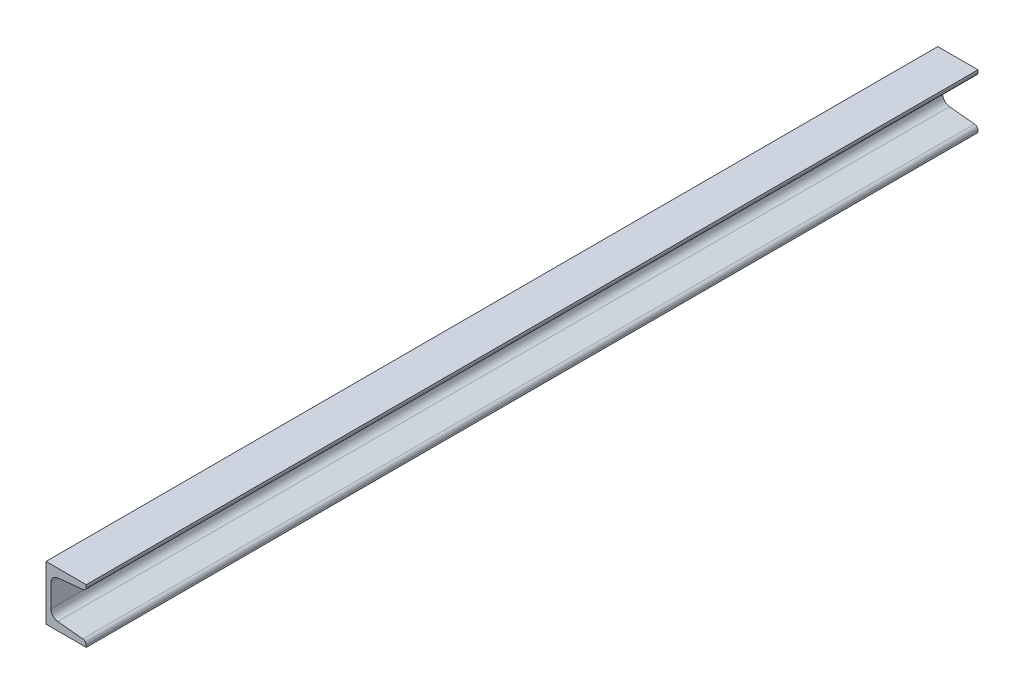
ISO-10303-21;
HEADER;
FILE_DESCRIPTION(('STEP AP214'),'2;1');
FILE_NAME('part.step','',(''),(''),'','','');
FILE_SCHEMA(('AUTOMOTIVE_DESIGN { 1 0 10303 214 1 1 1 1 }'));
ENDSEC;
DATA;
#1=APPLICATION_CONTEXT('core data for automotive mechanical design processes');
#2=APPLICATION_PROTOCOL_DEFINITION('international standard','automotive_design',2000,#1);
#3=PRODUCT_CONTEXT('',#1,'mechanical');
#4=PRODUCT('Part','Part','',(#3));
#5=PRODUCT_RELATED_PRODUCT_CATEGORY('part','',(#4));
#6=PRODUCT_DEFINITION_FORMATION('','',#4);
#7=PRODUCT_DEFINITION_CONTEXT('part definition',#1,'design');
#8=PRODUCT_DEFINITION('design','',#6,#7);
#9=PRODUCT_DEFINITION_SHAPE('','',#8);
#10=(LENGTH_UNIT() NAMED_UNIT(*) SI_UNIT(.MILLI.,.METRE.));
#11=(NAMED_UNIT(*) PLANE_ANGLE_UNIT() SI_UNIT($,.RADIAN.));
#12=(NAMED_UNIT(*) SI_UNIT($,.STERADIAN.) SOLID_ANGLE_UNIT());
#13=UNCERTAINTY_MEASURE_WITH_UNIT(LENGTH_MEASURE(1.E-05),#10,'distance_accuracy_value','');
#14=(GEOMETRIC_REPRESENTATION_CONTEXT(3) GLOBAL_UNCERTAINTY_ASSIGNED_CONTEXT((#13)) GLOBAL_UNIT_ASSIGNED_CONTEXT((#10,
#11,#12)) REPRESENTATION_CONTEXT('',''));
#15=CARTESIAN_POINT('',(0.,0.,0.));
#16=DIRECTION('',(0.,0.,1.));
#17=DIRECTION('',(1.,0.,0.));
#18=AXIS2_PLACEMENT_3D('',#15,#16,#17);
#19=CARTESIAN_POINT('',(0.,0.,820.));
#20=DIRECTION('',(0.,1.,0.));
#21=DIRECTION('',(0.,0.,1.));
#22=AXIS2_PLACEMENT_3D('',#19,#20,#21);
#23=PLANE('',#22);
#24=DIRECTION('',(1.,0.,0.));
#25=VECTOR('',#24,1.);
#26=CARTESIAN_POINT('',(0.,0.,0.));
#27=LINE('',#26,#25);
#28=CARTESIAN_POINT('',(0.,0.,0.));
#29=VERTEX_POINT('',#28);
#30=CARTESIAN_POINT('',(37.,0.,0.));
#31=VERTEX_POINT('',#30);
#32=EDGE_CURVE('E156',#29,#31,#27,.T.);
#33=ORIENTED_EDGE('',*,*,#32,.T.);
#34=DIRECTION('',(0.,0.,-1.));
#35=VECTOR('',#34,1.);
#36=CARTESIAN_POINT('',(37.,0.,820.));
#37=LINE('',#36,#35);
#38=CARTESIAN_POINT('',(37.,0.,820.));
#39=VERTEX_POINT('',#38);
#40=EDGE_CURVE('E11',#39,#31,#37,.T.);
#41=ORIENTED_EDGE('',*,*,#40,.F.);
#42=DIRECTION('',(1.,0.,0.));
#43=VECTOR('',#42,1.);
#44=CARTESIAN_POINT('',(0.,0.,820.));
#45=LINE('',#44,#43);
#46=CARTESIAN_POINT('',(0.,0.,820.));
#47=VERTEX_POINT('',#46);
#48=EDGE_CURVE('E178',#47,#39,#45,.T.);
#49=ORIENTED_EDGE('',*,*,#48,.F.);
#50=DIRECTION('',(0.,0.,-1.));
#51=VECTOR('',#50,1.);
#52=CARTESIAN_POINT('',(0.,0.,820.));
#53=LINE('',#52,#51);
#54=EDGE_CURVE('E152',#47,#29,#53,.T.);
#55=ORIENTED_EDGE('',*,*,#54,.T.);
#56=EDGE_LOOP('',(#33,#41,#49,#55));
#57=FACE_BOUND('',#56,.T.);
#58=ADVANCED_FACE('F36',(#57),#23,.F.);
#59=CARTESIAN_POINT('',(37.,0.,820.));
#60=DIRECTION('',(-1.,0.,0.));
#61=DIRECTION('',(0.,0.,1.));
#62=AXIS2_PLACEMENT_3D('',#59,#60,#61);
#63=PLANE('',#62);
#64=DIRECTION('',(0.,1.,0.));
#65=VECTOR('',#64,1.);
#66=CARTESIAN_POINT('',(37.,0.,0.));
#67=LINE('',#66,#65);
#68=CARTESIAN_POINT('',(37.,1.75754353260767,0.));
#69=VERTEX_POINT('',#68);
#70=EDGE_CURVE('E159',#31,#69,#67,.T.);
#71=ORIENTED_EDGE('',*,*,#70,.T.);
#72=DIRECTION('',(0.,0.,-1.));
#73=VECTOR('',#72,1.);
#74=CARTESIAN_POINT('',(37.,1.75754353260767,820.));
#75=LINE('',#74,#73);
#76=CARTESIAN_POINT('',(37.,1.75754353260767,820.));
#77=VERTEX_POINT('',#76);
#78=EDGE_CURVE('E44',#77,#69,#75,.T.);
#79=ORIENTED_EDGE('',*,*,#78,.F.);
#80=DIRECTION('',(0.,1.,0.));
#81=VECTOR('',#80,1.);
#82=CARTESIAN_POINT('',(37.,0.,820.));
#83=LINE('',#82,#81);
#84=EDGE_CURVE('E107',#39,#77,#83,.T.);
#85=ORIENTED_EDGE('',*,*,#84,.F.);
#86=ORIENTED_EDGE('',*,*,#40,.T.);
#87=EDGE_LOOP('',(#71,#79,#85,#86));
#88=FACE_BOUND('',#87,.T.);
#89=ADVANCED_FACE('F256',(#88),#63,.F.);
#90=CARTESIAN_POINT('',(33.5,1.75754353260769,820.));
#91=DIRECTION('',(0.,0.,-1.));
#92=DIRECTION('',(-1.,0.,0.));
#93=AXIS2_PLACEMENT_3D('',#90,#91,#92);
#94=CYLINDRICAL_SURFACE('',#93,3.5);
#95=CARTESIAN_POINT('',(33.5,1.75754353260769,0.));
#96=DIRECTION('',(0.,0.,1.));
#97=DIRECTION('',(1.,0.,0.));
#98=AXIS2_PLACEMENT_3D('',#95,#96,#97);
#99=CIRCLE('',#98,3.5);
#100=CARTESIAN_POINT('',(33.8482630165735,5.24017369834266,0.));
#101=VERTEX_POINT('',#100);
#102=EDGE_CURVE('E161',#69,#101,#99,.T.);
#103=ORIENTED_EDGE('',*,*,#102,.T.);
#104=DIRECTION('',(0.,0.,-1.));
#105=VECTOR('',#104,1.);
#106=CARTESIAN_POINT('',(33.8482630165735,5.24017369834266,820.));
#107=LINE('',#106,#105);
#108=CARTESIAN_POINT('',(33.8482630165735,5.24017369834266,820.));
#109=VERTEX_POINT('',#108);
#110=EDGE_CURVE('E197',#109,#101,#107,.T.);
#111=ORIENTED_EDGE('',*,*,#110,.F.);
#112=CARTESIAN_POINT('',(33.5,1.75754353260769,820.));
#113=DIRECTION('',(0.,0.,1.));
#114=DIRECTION('',(1.,0.,0.));
#115=AXIS2_PLACEMENT_3D('',#112,#113,#114);
#116=CIRCLE('',#115,3.5);
#117=EDGE_CURVE('E205',#77,#109,#116,.T.);
#118=ORIENTED_EDGE('',*,*,#117,.F.);
#119=ORIENTED_EDGE('',*,*,#78,.T.);
#120=EDGE_LOOP('',(#103,#111,#118,#119));
#121=FACE_BOUND('',#120,.T.);
#122=ADVANCED_FACE('F203',(#121),#94,.T.);
#123=CARTESIAN_POINT('',(10.8034739668531,7.5446526033147,820.));
#124=DIRECTION('',(-0.0995037190209989,-0.995037190209989,0.));
#125=DIRECTION('',(0.995037190209989,-0.0995037190209989,0.));
#126=AXIS2_PLACEMENT_3D('',#123,#124,#125);
#127=PLANE('',#126);
#128=DIRECTION('',(-0.995037190209989,0.0995037190209989,0.));
#129=VECTOR('',#128,1.);
#130=CARTESIAN_POINT('',(10.8034739668531,7.5446526033147,0.));
#131=LINE('',#130,#129);
#132=CARTESIAN_POINT('',(10.8034739668531,7.5446526033147,0.));
#133=VERTEX_POINT('',#132);
#134=EDGE_CURVE('E163',#101,#133,#131,.T.);
#135=ORIENTED_EDGE('',*,*,#134,.T.);
#136=DIRECTION('',(0.,0.,-1.));
#137=VECTOR('',#136,1.);
#138=CARTESIAN_POINT('',(10.8034739668531,7.5446526033147,820.));
#139=LINE('',#138,#137);
#140=CARTESIAN_POINT('',(10.8034739668531,7.5446526033147,820.));
#141=VERTEX_POINT('',#140);
#142=EDGE_CURVE('E194',#141,#133,#139,.T.);
#143=ORIENTED_EDGE('',*,*,#142,.F.);
#144=DIRECTION('',(-0.995037190209989,0.0995037190209989,0.));
#145=VECTOR('',#144,1.);
#146=CARTESIAN_POINT('',(10.8034739668531,7.5446526033147,820.));
#147=LINE('',#146,#145);
#148=EDGE_CURVE('E223',#109,#141,#147,.T.);
#149=ORIENTED_EDGE('',*,*,#148,.F.);
#150=ORIENTED_EDGE('',*,*,#110,.T.);
#151=EDGE_LOOP('',(#135,#143,#149,#150));
#152=FACE_BOUND('',#151,.T.);
#153=ADVANCED_FACE('F214',(#152),#127,.F.);
#154=CARTESIAN_POINT('',(11.5,14.5099129347846,820.));
#155=DIRECTION('',(0.,0.,-1.));
#156=DIRECTION('',(-1.,0.,0.));
#157=AXIS2_PLACEMENT_3D('',#154,#155,#156);
#158=CYLINDRICAL_SURFACE('',#157,7.);
#159=CARTESIAN_POINT('',(11.5,14.5099129347846,0.));
#160=DIRECTION('',(0.,0.,-1.));
#161=DIRECTION('',(1.,0.,0.));
#162=AXIS2_PLACEMENT_3D('',#159,#160,#161);
#163=CIRCLE('',#162,7.);
#164=CARTESIAN_POINT('',(4.5,14.5099129347847,0.));
#165=VERTEX_POINT('',#164);
#166=EDGE_CURVE('E165',#133,#165,#163,.T.);
#167=ORIENTED_EDGE('',*,*,#166,.T.);
#168=DIRECTION('',(0.,0.,-1.));
#169=VECTOR('',#168,1.);
#170=CARTESIAN_POINT('',(4.5,14.5099129347847,820.));
#171=LINE('',#170,#169);
#172=CARTESIAN_POINT('',(4.5,14.5099129347847,820.));
#173=VERTEX_POINT('',#172);
#174=EDGE_CURVE('E191',#173,#165,#171,.T.);
#175=ORIENTED_EDGE('',*,*,#174,.F.);
#176=CARTESIAN_POINT('',(11.5,14.5099129347846,820.));
#177=DIRECTION('',(0.,0.,-1.));
#178=DIRECTION('',(1.,0.,0.));
#179=AXIS2_PLACEMENT_3D('',#176,#177,#178);
#180=CIRCLE('',#179,7.);
#181=EDGE_CURVE('E220',#141,#173,#180,.T.);
#182=ORIENTED_EDGE('',*,*,#181,.F.);
#183=ORIENTED_EDGE('',*,*,#142,.T.);
#184=EDGE_LOOP('',(#167,#175,#182,#183));
#185=FACE_BOUND('',#184,.T.);
#186=ADVANCED_FACE('F218',(#185),#158,.F.);
#187=CARTESIAN_POINT('',(4.5,14.5099129347847,820.));
#188=DIRECTION('',(-1.,0.,0.));
#189=DIRECTION('',(0.,-1.,0.));
#190=AXIS2_PLACEMENT_3D('',#187,#188,#189);
#191=PLANE('',#190);
#192=DIRECTION('',(0.,1.,0.));
#193=VECTOR('',#192,1.);
#194=CARTESIAN_POINT('',(4.5,14.5099129347847,0.));
#195=LINE('',#194,#193);
#196=CARTESIAN_POINT('',(4.5,35.2876429963102,0.));
#197=VERTEX_POINT('',#196);
#198=EDGE_CURVE('E167',#165,#197,#195,.T.);
#199=ORIENTED_EDGE('',*,*,#198,.T.);
#200=DIRECTION('',(0.,0.,-1.));
#201=VECTOR('',#200,1.);
#202=CARTESIAN_POINT('',(4.5,35.2876429963102,820.));
#203=LINE('',#202,#201);
#204=CARTESIAN_POINT('',(4.5,35.2876429963102,820.));
#205=VERTEX_POINT('',#204);
#206=EDGE_CURVE('E188',#205,#197,#203,.T.);
#207=ORIENTED_EDGE('',*,*,#206,.F.);
#208=DIRECTION('',(0.,1.,0.));
#209=VECTOR('',#208,1.);
#210=CARTESIAN_POINT('',(4.5,14.5099129347847,820.));
#211=LINE('',#210,#209);
#212=EDGE_CURVE('E222',#173,#205,#211,.T.);
#213=ORIENTED_EDGE('',*,*,#212,.F.);
#214=ORIENTED_EDGE('',*,*,#174,.T.);
#215=EDGE_LOOP('',(#199,#207,#213,#214));
#216=FACE_BOUND('',#215,.T.);
#217=ADVANCED_FACE('F269',(#216),#191,.F.);
#218=CARTESIAN_POINT('',(11.5,35.2876429963103,820.));
#219=DIRECTION('',(0.,0.,-1.));
#220=DIRECTION('',(-1.,0.,0.));
#221=AXIS2_PLACEMENT_3D('',#218,#219,#220);
#222=CYLINDRICAL_SURFACE('',#221,7.);
#223=CARTESIAN_POINT('',(11.5,35.2876429963103,0.));
#224=DIRECTION('',(0.,0.,-1.));
#225=DIRECTION('',(1.,0.,0.));
#226=AXIS2_PLACEMENT_3D('',#223,#224,#225);
#227=CIRCLE('',#226,7.);
#228=CARTESIAN_POINT('',(10.803473966853,42.2529033277802,0.));
#229=VERTEX_POINT('',#228);
#230=EDGE_CURVE('E169',#197,#229,#227,.T.);
#231=ORIENTED_EDGE('',*,*,#230,.T.);
#232=DIRECTION('',(0.,0.,-1.));
#233=VECTOR('',#232,1.);
#234=CARTESIAN_POINT('',(10.803473966853,42.2529033277802,820.));
#235=LINE('',#234,#233);
#236=CARTESIAN_POINT('',(10.803473966853,42.2529033277802,820.));
#237=VERTEX_POINT('',#236);
#238=EDGE_CURVE('E185',#237,#229,#235,.T.);
#239=ORIENTED_EDGE('',*,*,#238,.F.);
#240=CARTESIAN_POINT('',(11.5,35.2876429963103,820.));
#241=DIRECTION('',(0.,0.,-1.));
#242=DIRECTION('',(1.,0.,0.));
#243=AXIS2_PLACEMENT_3D('',#240,#241,#242);
#244=CIRCLE('',#243,7.);
#245=EDGE_CURVE('E225',#205,#237,#244,.T.);
#246=ORIENTED_EDGE('',*,*,#245,.F.);
#247=ORIENTED_EDGE('',*,*,#206,.T.);
#248=EDGE_LOOP('',(#231,#239,#246,#247));
#249=FACE_BOUND('',#248,.T.);
#250=ADVANCED_FACE('F272',(#249),#222,.F.);
#251=CARTESIAN_POINT('',(10.803473966853,42.2529033277802,820.));
#252=DIRECTION('',(-0.0995037190209989,0.995037190209989,0.));
#253=DIRECTION('',(-0.995037190209989,-0.0995037190209989,0.));
#254=AXIS2_PLACEMENT_3D('',#251,#252,#253);
#255=PLANE('',#254);
#256=DIRECTION('',(0.995037190209989,0.0995037190209989,0.));
#257=VECTOR('',#256,1.);
#258=CARTESIAN_POINT('',(10.803473966853,42.2529033277802,0.));
#259=LINE('',#258,#257);
#260=CARTESIAN_POINT('',(33.8482630165735,44.5573822327522,0.));
#261=VERTEX_POINT('',#260);
#262=EDGE_CURVE('E171',#229,#261,#259,.T.);
#263=ORIENTED_EDGE('',*,*,#262,.T.);
#264=DIRECTION('',(0.,0.,-1.));
#265=VECTOR('',#264,1.);
#266=CARTESIAN_POINT('',(33.8482630165735,44.5573822327522,820.));
#267=LINE('',#266,#265);
#268=CARTESIAN_POINT('',(33.8482630165735,44.5573822327522,820.));
#269=VERTEX_POINT('',#268);
#270=EDGE_CURVE('E182',#269,#261,#267,.T.);
#271=ORIENTED_EDGE('',*,*,#270,.F.);
#272=DIRECTION('',(0.995037190209989,0.0995037190209989,0.));
#273=VECTOR('',#272,1.);
#274=CARTESIAN_POINT('',(10.803473966853,42.2529033277802,820.));
#275=LINE('',#274,#273);
#276=EDGE_CURVE('E231',#237,#269,#275,.T.);
#277=ORIENTED_EDGE('',*,*,#276,.F.);
#278=ORIENTED_EDGE('',*,*,#238,.T.);
#279=EDGE_LOOP('',(#263,#271,#277,#278));
#280=FACE_BOUND('',#279,.T.);
#281=ADVANCED_FACE('F237',(#280),#255,.F.);
#282=CARTESIAN_POINT('',(33.5,48.0400123984872,820.));
#283=DIRECTION('',(0.,0.,-1.));
#284=DIRECTION('',(-1.,0.,0.));
#285=AXIS2_PLACEMENT_3D('',#282,#283,#284);
#286=CYLINDRICAL_SURFACE('',#285,3.50000000000001);
#287=CARTESIAN_POINT('',(33.5,48.0400123984872,0.));
#288=DIRECTION('',(0.,0.,1.));
#289=DIRECTION('',(1.,0.,0.));
#290=AXIS2_PLACEMENT_3D('',#287,#288,#289);
#291=CIRCLE('',#290,3.50000000000001);
#292=CARTESIAN_POINT('',(37.,48.0400123984872,0.));
#293=VERTEX_POINT('',#292);
#294=EDGE_CURVE('E173',#261,#293,#291,.T.);
#295=ORIENTED_EDGE('',*,*,#294,.T.);
#296=DIRECTION('',(0.,0.,-1.));
#297=VECTOR('',#296,1.);
#298=CARTESIAN_POINT('',(37.,48.0400123984872,820.));
#299=LINE('',#298,#297);
#300=CARTESIAN_POINT('',(37.,48.0400123984872,820.));
#301=VERTEX_POINT('',#300);
#302=EDGE_CURVE('E147',#301,#293,#299,.T.);
#303=ORIENTED_EDGE('',*,*,#302,.F.);
#304=CARTESIAN_POINT('',(33.5,48.0400123984872,820.));
#305=DIRECTION('',(0.,0.,1.));
#306=DIRECTION('',(1.,0.,0.));
#307=AXIS2_PLACEMENT_3D('',#304,#305,#306);
#308=CIRCLE('',#307,3.50000000000001);
#309=EDGE_CURVE('E138',#269,#301,#308,.T.);
#310=ORIENTED_EDGE('',*,*,#309,.F.);
#311=ORIENTED_EDGE('',*,*,#270,.T.);
#312=EDGE_LOOP('',(#295,#303,#310,#311));
#313=FACE_BOUND('',#312,.T.);
#314=ADVANCED_FACE('F241',(#313),#286,.T.);
#315=CARTESIAN_POINT('',(37.,48.0400123984872,820.));
#316=DIRECTION('',(-1.,0.,0.));
#317=DIRECTION('',(0.,0.,1.));
#318=AXIS2_PLACEMENT_3D('',#315,#316,#317);
#319=PLANE('',#318);
#320=DIRECTION('',(0.,1.,0.));
#321=VECTOR('',#320,1.);
#322=CARTESIAN_POINT('',(37.,48.0400123984872,0.));
#323=LINE('',#322,#321);
#324=CARTESIAN_POINT('',(37.,50.,0.));
#325=VERTEX_POINT('',#324);
#326=EDGE_CURVE('E146',#293,#325,#323,.T.);
#327=ORIENTED_EDGE('',*,*,#326,.T.);
#328=DIRECTION('',(0.,0.,-1.));
#329=VECTOR('',#328,1.);
#330=CARTESIAN_POINT('',(37.,50.,820.));
#331=LINE('',#330,#329);
#332=CARTESIAN_POINT('',(37.,50.,820.));
#333=VERTEX_POINT('',#332);
#334=EDGE_CURVE('E143',#333,#325,#331,.T.);
#335=ORIENTED_EDGE('',*,*,#334,.F.);
#336=DIRECTION('',(0.,1.,0.));
#337=VECTOR('',#336,1.);
#338=CARTESIAN_POINT('',(37.,48.0400123984872,820.));
#339=LINE('',#338,#337);
#340=EDGE_CURVE('E132',#301,#333,#339,.T.);
#341=ORIENTED_EDGE('',*,*,#340,.F.);
#342=ORIENTED_EDGE('',*,*,#302,.T.);
#343=EDGE_LOOP('',(#327,#335,#341,#342));
#344=FACE_BOUND('',#343,.T.);
#345=ADVANCED_FACE('F144',(#344),#319,.F.);
#346=CARTESIAN_POINT('',(-1.71512449944288E-13,50.,820.));
#347=DIRECTION('',(0.,-1.,0.));
#348=DIRECTION('',(0.,0.,-1.));
#349=AXIS2_PLACEMENT_3D('',#346,#347,#348);
#350=PLANE('',#349);
#351=DIRECTION('',(-1.,0.,0.));
#352=VECTOR('',#351,1.);
#353=CARTESIAN_POINT('',(-1.71512449944288E-13,50.,0.));
#354=LINE('',#353,#352);
#355=CARTESIAN_POINT('',(-1.71512449944288E-13,50.,0.));
#356=VERTEX_POINT('',#355);
#357=EDGE_CURVE('E93',#325,#356,#354,.T.);
#358=ORIENTED_EDGE('',*,*,#357,.T.);
#359=DIRECTION('',(0.,0.,-1.));
#360=VECTOR('',#359,1.);
#361=CARTESIAN_POINT('',(-1.71512449944288E-13,50.,820.));
#362=LINE('',#361,#360);
#363=CARTESIAN_POINT('',(-1.71512449944288E-13,50.,820.));
#364=VERTEX_POINT('',#363);
#365=EDGE_CURVE('E148',#364,#356,#362,.T.);
#366=ORIENTED_EDGE('',*,*,#365,.F.);
#367=DIRECTION('',(-1.,0.,0.));
#368=VECTOR('',#367,1.);
#369=CARTESIAN_POINT('',(-1.71512449944288E-13,50.,820.));
#370=LINE('',#369,#368);
#371=EDGE_CURVE('E136',#333,#364,#370,.T.);
#372=ORIENTED_EDGE('',*,*,#371,.F.);
#373=ORIENTED_EDGE('',*,*,#334,.T.);
#374=EDGE_LOOP('',(#358,#366,#372,#373));
#375=FACE_BOUND('',#374,.T.);
#376=ADVANCED_FACE('F150',(#375),#350,.F.);
#377=CARTESIAN_POINT('',(0.,0.,820.));
#378=DIRECTION('',(1.,0.,0.));
#379=DIRECTION('',(0.,1.,0.));
#380=AXIS2_PLACEMENT_3D('',#377,#378,#379);
#381=PLANE('',#380);
#382=DIRECTION('',(0.,-1.,0.));
#383=VECTOR('',#382,1.);
#384=CARTESIAN_POINT('',(0.,0.,0.));
#385=LINE('',#384,#383);
#386=EDGE_CURVE('E99',#356,#29,#385,.T.);
#387=ORIENTED_EDGE('',*,*,#386,.T.);
#388=ORIENTED_EDGE('',*,*,#54,.F.);
#389=DIRECTION('',(0.,-1.,0.));
#390=VECTOR('',#389,1.);
#391=CARTESIAN_POINT('',(0.,0.,820.));
#392=LINE('',#391,#390);
#393=EDGE_CURVE('E52',#364,#47,#392,.T.);
#394=ORIENTED_EDGE('',*,*,#393,.F.);
#395=ORIENTED_EDGE('',*,*,#365,.T.);
#396=EDGE_LOOP('',(#387,#388,#394,#395));
#397=FACE_BOUND('',#396,.T.);
#398=ADVANCED_FACE('F245',(#397),#381,.F.);
#399=CARTESIAN_POINT('',(33.5,1.75754353260769,820.));
#400=DIRECTION('',(0.,0.,1.));
#401=DIRECTION('',(1.,0.,0.));
#402=AXIS2_PLACEMENT_3D('',#399,#400,#401);
#403=PLANE('',#402);
#404=ORIENTED_EDGE('',*,*,#48,.T.);
#405=ORIENTED_EDGE('',*,*,#84,.T.);
#406=ORIENTED_EDGE('',*,*,#117,.T.);
#407=ORIENTED_EDGE('',*,*,#148,.T.);
#408=ORIENTED_EDGE('',*,*,#181,.T.);
#409=ORIENTED_EDGE('',*,*,#212,.T.);
#410=ORIENTED_EDGE('',*,*,#245,.T.);
#411=ORIENTED_EDGE('',*,*,#276,.T.);
#412=ORIENTED_EDGE('',*,*,#309,.T.);
#413=ORIENTED_EDGE('',*,*,#340,.T.);
#414=ORIENTED_EDGE('',*,*,#371,.T.);
#415=ORIENTED_EDGE('',*,*,#393,.T.);
#416=EDGE_LOOP('',(#404,#405,#406,#407,#408,#409,#410,#411,#412,#413,#414,#415));
#417=FACE_BOUND('',#416,.T.);
#418=ADVANCED_FACE('F134',(#417),#403,.T.);
#419=CARTESIAN_POINT('',(33.5,1.75754353260769,0.));
#420=DIRECTION('',(0.,0.,1.));
#421=DIRECTION('',(1.,0.,0.));
#422=AXIS2_PLACEMENT_3D('',#419,#420,#421);
#423=PLANE('',#422);
#424=ORIENTED_EDGE('',*,*,#32,.F.);
#425=ORIENTED_EDGE('',*,*,#386,.F.);
#426=ORIENTED_EDGE('',*,*,#357,.F.);
#427=ORIENTED_EDGE('',*,*,#326,.F.);
#428=ORIENTED_EDGE('',*,*,#294,.F.);
#429=ORIENTED_EDGE('',*,*,#262,.F.);
#430=ORIENTED_EDGE('',*,*,#230,.F.);
#431=ORIENTED_EDGE('',*,*,#198,.F.);
#432=ORIENTED_EDGE('',*,*,#166,.F.);
#433=ORIENTED_EDGE('',*,*,#134,.F.);
#434=ORIENTED_EDGE('',*,*,#102,.F.);
#435=ORIENTED_EDGE('',*,*,#70,.F.);
#436=EDGE_LOOP('',(#424,#425,#426,#427,#428,#429,#430,#431,#432,#433,#434,#435));
#437=FACE_BOUND('',#436,.T.);
#438=ADVANCED_FACE('F209',(#437),#423,.F.);
#439=CLOSED_SHELL('',(#58,#89,#122,#153,#186,#217,#250,#281,#314,#345,#376,#398,#418,#438));
#440=MANIFOLD_SOLID_BREP('B2',#439);
#441=ADVANCED_BREP_SHAPE_REPRESENTATION('',(#18,#440),#14);
#442=SHAPE_DEFINITION_REPRESENTATION(#9,#441);
ENDSEC;
END-ISO-10303-21;
